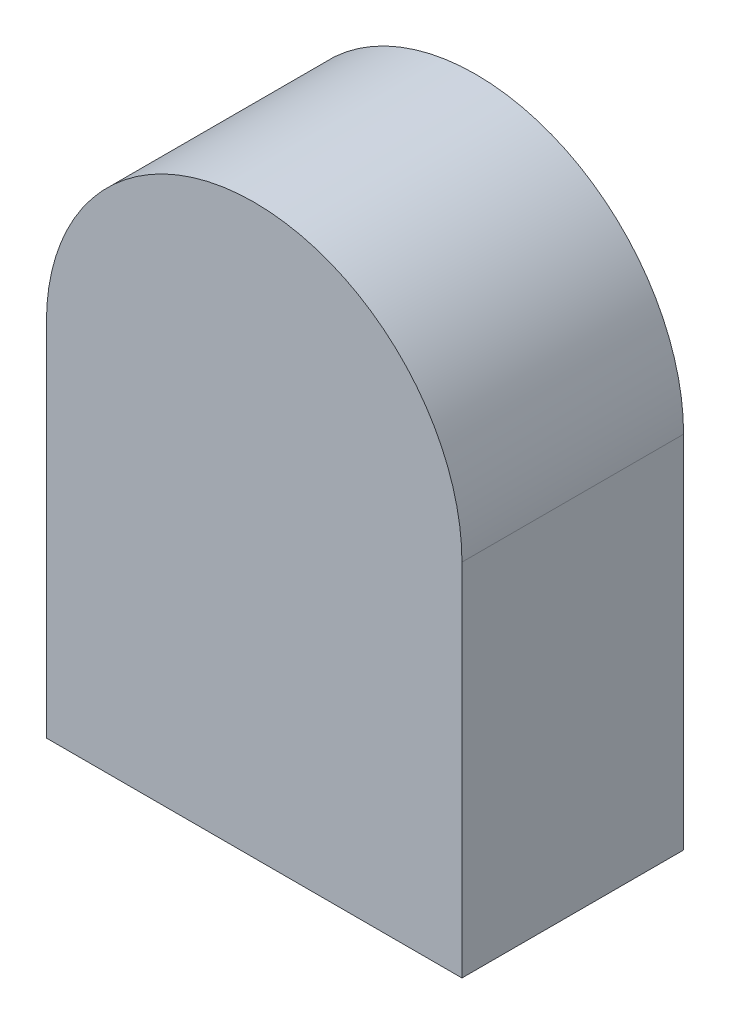
ISO-10303-21;
HEADER;
FILE_DESCRIPTION(('STEP AP214'),'2;1');
FILE_NAME('part.step','',(''),(''),'','','');
FILE_SCHEMA(('AUTOMOTIVE_DESIGN { 1 0 10303 214 1 1 1 1 }'));
ENDSEC;
DATA;
#1=APPLICATION_CONTEXT('core data for automotive mechanical design processes');
#2=APPLICATION_PROTOCOL_DEFINITION('international standard','automotive_design',2000,#1);
#3=PRODUCT_CONTEXT('',#1,'mechanical');
#4=PRODUCT('Part','Part','',(#3));
#5=PRODUCT_RELATED_PRODUCT_CATEGORY('part','',(#4));
#6=PRODUCT_DEFINITION_FORMATION('','',#4);
#7=PRODUCT_DEFINITION_CONTEXT('part definition',#1,'design');
#8=PRODUCT_DEFINITION('design','',#6,#7);
#9=PRODUCT_DEFINITION_SHAPE('','',#8);
#10=(LENGTH_UNIT() NAMED_UNIT(*) SI_UNIT(.MILLI.,.METRE.));
#11=(NAMED_UNIT(*) PLANE_ANGLE_UNIT() SI_UNIT($,.RADIAN.));
#12=(NAMED_UNIT(*) SI_UNIT($,.STERADIAN.) SOLID_ANGLE_UNIT());
#13=UNCERTAINTY_MEASURE_WITH_UNIT(LENGTH_MEASURE(1.E-05),#10,'distance_accuracy_value','');
#14=(GEOMETRIC_REPRESENTATION_CONTEXT(3) GLOBAL_UNCERTAINTY_ASSIGNED_CONTEXT((#13)) GLOBAL_UNIT_ASSIGNED_CONTEXT((#10,
#11,#12)) REPRESENTATION_CONTEXT('',''));
#15=CARTESIAN_POINT('',(0.,0.,0.));
#16=DIRECTION('',(0.,0.,1.));
#17=DIRECTION('',(1.,0.,0.));
#18=AXIS2_PLACEMENT_3D('',#15,#16,#17);
#19=CARTESIAN_POINT('',(-14.,0.,16.));
#20=DIRECTION('',(1.,0.,0.));
#21=DIRECTION('',(0.,0.,-1.));
#22=AXIS2_PLACEMENT_3D('',#19,#20,#21);
#23=PLANE('',#22);
#24=DIRECTION('',(0.,0.,-1.));
#25=VECTOR('',#24,1.);
#26=CARTESIAN_POINT('',(-14.,26.,16.));
#27=LINE('',#26,#25);
#28=CARTESIAN_POINT('',(-14.,26.,14.5));
#29=VERTEX_POINT('',#28);
#30=CARTESIAN_POINT('',(-14.,26.,0.));
#31=VERTEX_POINT('',#30);
#32=EDGE_CURVE('E166',#29,#31,#27,.T.);
#33=ORIENTED_EDGE('',*,*,#32,.F.);
#34=DIRECTION('',(0.,-1.,0.));
#35=VECTOR('',#34,1.);
#36=CARTESIAN_POINT('',(-14.,0.,14.5));
#37=LINE('',#36,#35);
#38=CARTESIAN_POINT('',(-14.,1.,14.5));
#39=VERTEX_POINT('',#38);
#40=EDGE_CURVE('E76',#29,#39,#37,.T.);
#41=ORIENTED_EDGE('',*,*,#40,.T.);
#42=DIRECTION('',(0.,0.,-1.));
#43=VECTOR('',#42,1.);
#44=CARTESIAN_POINT('',(-14.,1.,16.));
#45=LINE('',#44,#43);
#46=CARTESIAN_POINT('',(-14.,1.,0.));
#47=VERTEX_POINT('',#46);
#48=EDGE_CURVE('E168',#39,#47,#45,.T.);
#49=ORIENTED_EDGE('',*,*,#48,.T.);
#50=DIRECTION('',(0.,-1.,0.));
#51=VECTOR('',#50,1.);
#52=CARTESIAN_POINT('',(-14.,0.,0.));
#53=LINE('',#52,#51);
#54=EDGE_CURVE('E230',#31,#47,#53,.T.);
#55=ORIENTED_EDGE('',*,*,#54,.F.);
#56=EDGE_LOOP('',(#33,#41,#49,#55));
#57=FACE_BOUND('',#56,.T.);
#58=ADVANCED_FACE('F61',(#57),#23,.T.);
#59=CARTESIAN_POINT('',(-15.,1.,16.));
#60=DIRECTION('',(0.,1.,0.));
#61=DIRECTION('',(-1.,0.,0.));
#62=AXIS2_PLACEMENT_3D('',#59,#60,#61);
#63=PLANE('',#62);
#64=ORIENTED_EDGE('',*,*,#48,.F.);
#65=DIRECTION('',(1.,0.,0.));
#66=VECTOR('',#65,1.);
#67=CARTESIAN_POINT('',(-15.,1.,14.5));
#68=LINE('',#67,#66);
#69=CARTESIAN_POINT('',(14.,1.00000000000001,14.5));
#70=VERTEX_POINT('',#69);
#71=EDGE_CURVE('E160',#39,#70,#68,.T.);
#72=ORIENTED_EDGE('',*,*,#71,.T.);
#73=DIRECTION('',(0.,0.,-1.));
#74=VECTOR('',#73,1.);
#75=CARTESIAN_POINT('',(14.,1.00000000000001,16.));
#76=LINE('',#75,#74);
#77=CARTESIAN_POINT('',(14.,1.00000000000001,0.));
#78=VERTEX_POINT('',#77);
#79=EDGE_CURVE('E159',#70,#78,#76,.T.);
#80=ORIENTED_EDGE('',*,*,#79,.T.);
#81=DIRECTION('',(1.,0.,0.));
#82=VECTOR('',#81,1.);
#83=CARTESIAN_POINT('',(-15.,1.,0.));
#84=LINE('',#83,#82);
#85=CARTESIAN_POINT('',(3.,1.,0.));
#86=VERTEX_POINT('',#85);
#87=EDGE_CURVE('E223',#86,#78,#84,.T.);
#88=ORIENTED_EDGE('',*,*,#87,.F.);
#89=DIRECTION('',(0.,0.,-1.));
#90=VECTOR('',#89,1.);
#91=CARTESIAN_POINT('',(3.,1.,16.));
#92=LINE('',#91,#90);
#93=CARTESIAN_POINT('',(3.,1.,7.));
#94=VERTEX_POINT('',#93);
#95=EDGE_CURVE('E69',#94,#86,#92,.T.);
#96=ORIENTED_EDGE('',*,*,#95,.F.);
#97=CARTESIAN_POINT('',(0.,1.,7.));
#98=DIRECTION('',(0.,1.,0.));
#99=DIRECTION('',(-1.,0.,0.));
#100=AXIS2_PLACEMENT_3D('',#97,#98,#99);
#101=CIRCLE('',#100,3.);
#102=CARTESIAN_POINT('',(-3.,1.,7.));
#103=VERTEX_POINT('',#102);
#104=EDGE_CURVE('E206',#103,#94,#101,.T.);
#105=ORIENTED_EDGE('',*,*,#104,.F.);
#106=DIRECTION('',(0.,0.,1.));
#107=VECTOR('',#106,1.);
#108=CARTESIAN_POINT('',(-3.,1.,16.));
#109=LINE('',#108,#107);
#110=CARTESIAN_POINT('',(-3.,1.,0.));
#111=VERTEX_POINT('',#110);
#112=EDGE_CURVE('E204',#111,#103,#109,.T.);
#113=ORIENTED_EDGE('',*,*,#112,.F.);
#114=EDGE_CURVE('E229',#47,#111,#84,.T.);
#115=ORIENTED_EDGE('',*,*,#114,.F.);
#116=EDGE_LOOP('',(#64,#72,#80,#88,#96,#105,#113,#115));
#117=FACE_BOUND('',#116,.T.);
#118=ADVANCED_FACE('F228',(#117),#63,.T.);
#119=CARTESIAN_POINT('',(14.,26.,16.));
#120=DIRECTION('',(-1.,0.,0.));
#121=DIRECTION('',(0.,-1.,0.));
#122=AXIS2_PLACEMENT_3D('',#119,#120,#121);
#123=PLANE('',#122);
#124=ORIENTED_EDGE('',*,*,#79,.F.);
#125=DIRECTION('',(0.,1.,0.));
#126=VECTOR('',#125,1.);
#127=CARTESIAN_POINT('',(14.,26.,14.5));
#128=LINE('',#127,#126);
#129=CARTESIAN_POINT('',(14.,26.,14.5));
#130=VERTEX_POINT('',#129);
#131=EDGE_CURVE('E148',#70,#130,#128,.T.);
#132=ORIENTED_EDGE('',*,*,#131,.T.);
#133=DIRECTION('',(0.,0.,-1.));
#134=VECTOR('',#133,1.);
#135=CARTESIAN_POINT('',(14.,26.,16.));
#136=LINE('',#135,#134);
#137=CARTESIAN_POINT('',(14.,26.,0.));
#138=VERTEX_POINT('',#137);
#139=EDGE_CURVE('E157',#130,#138,#136,.T.);
#140=ORIENTED_EDGE('',*,*,#139,.T.);
#141=DIRECTION('',(0.,1.,0.));
#142=VECTOR('',#141,1.);
#143=CARTESIAN_POINT('',(14.,26.,0.));
#144=LINE('',#143,#142);
#145=EDGE_CURVE('E233',#78,#138,#144,.T.);
#146=ORIENTED_EDGE('',*,*,#145,.F.);
#147=EDGE_LOOP('',(#124,#132,#140,#146));
#148=FACE_BOUND('',#147,.T.);
#149=ADVANCED_FACE('F155',(#148),#123,.T.);
#150=CARTESIAN_POINT('',(0.,26.,16.));
#151=DIRECTION('',(0.,0.,-1.));
#152=DIRECTION('',(-1.,0.,0.));
#153=AXIS2_PLACEMENT_3D('',#150,#151,#152);
#154=CYLINDRICAL_SURFACE('',#153,14.);
#155=ORIENTED_EDGE('',*,*,#139,.F.);
#156=CARTESIAN_POINT('',(0.,26.,14.5));
#157=DIRECTION('',(0.,0.,1.));
#158=DIRECTION('',(1.,0.,0.));
#159=AXIS2_PLACEMENT_3D('',#156,#157,#158);
#160=CIRCLE('',#159,14.);
#161=EDGE_CURVE('E12',#130,#29,#160,.T.);
#162=ORIENTED_EDGE('',*,*,#161,.T.);
#163=ORIENTED_EDGE('',*,*,#32,.T.);
#164=CARTESIAN_POINT('',(0.,26.,0.));
#165=DIRECTION('',(0.,0.,1.));
#166=DIRECTION('',(1.,0.,0.));
#167=AXIS2_PLACEMENT_3D('',#164,#165,#166);
#168=CIRCLE('',#167,14.);
#169=EDGE_CURVE('E164',#138,#31,#168,.T.);
#170=ORIENTED_EDGE('',*,*,#169,.F.);
#171=EDGE_LOOP('',(#155,#162,#163,#170));
#172=FACE_BOUND('',#171,.T.);
#173=ADVANCED_FACE('F162',(#172),#154,.F.);
#174=CARTESIAN_POINT('',(0.,26.,16.));
#175=DIRECTION('',(0.,0.,1.));
#176=DIRECTION('',(1.,0.,0.));
#177=AXIS2_PLACEMENT_3D('',#174,#175,#176);
#178=PLANE('',#177);
#179=DIRECTION('',(0.,-1.,0.));
#180=VECTOR('',#179,1.);
#181=CARTESIAN_POINT('',(-15.,0.,16.));
#182=LINE('',#181,#180);
#183=CARTESIAN_POINT('',(-15.,26.,16.));
#184=VERTEX_POINT('',#183);
#185=CARTESIAN_POINT('',(-15.,0.,16.));
#186=VERTEX_POINT('',#185);
#187=EDGE_CURVE('E175',#184,#186,#182,.T.);
#188=ORIENTED_EDGE('',*,*,#187,.T.);
#189=DIRECTION('',(1.,0.,0.));
#190=VECTOR('',#189,1.);
#191=CARTESIAN_POINT('',(-15.,0.,16.));
#192=LINE('',#191,#190);
#193=CARTESIAN_POINT('',(15.,0.,16.));
#194=VERTEX_POINT('',#193);
#195=EDGE_CURVE('E178',#186,#194,#192,.T.);
#196=ORIENTED_EDGE('',*,*,#195,.T.);
#197=DIRECTION('',(0.,1.,0.));
#198=VECTOR('',#197,1.);
#199=CARTESIAN_POINT('',(15.,26.,16.));
#200=LINE('',#199,#198);
#201=CARTESIAN_POINT('',(15.,26.,16.));
#202=VERTEX_POINT('',#201);
#203=EDGE_CURVE('E181',#194,#202,#200,.T.);
#204=ORIENTED_EDGE('',*,*,#203,.T.);
#205=CARTESIAN_POINT('',(0.,26.,16.));
#206=DIRECTION('',(0.,0.,1.));
#207=DIRECTION('',(1.,0.,0.));
#208=AXIS2_PLACEMENT_3D('',#205,#206,#207);
#209=CIRCLE('',#208,15.);
#210=EDGE_CURVE('E183',#202,#184,#209,.T.);
#211=ORIENTED_EDGE('',*,*,#210,.T.);
#212=EDGE_LOOP('',(#188,#196,#204,#211));
#213=FACE_BOUND('',#212,.T.);
#214=ADVANCED_FACE('F277',(#213),#178,.T.);
#215=CARTESIAN_POINT('',(0.,26.,0.));
#216=DIRECTION('',(0.,0.,1.));
#217=DIRECTION('',(1.,0.,0.));
#218=AXIS2_PLACEMENT_3D('',#215,#216,#217);
#219=PLANE('',#218);
#220=DIRECTION('',(1.,0.,0.));
#221=VECTOR('',#220,1.);
#222=CARTESIAN_POINT('',(-15.,0.,0.));
#223=LINE('',#222,#221);
#224=CARTESIAN_POINT('',(3.,0.,0.));
#225=VERTEX_POINT('',#224);
#226=CARTESIAN_POINT('',(15.,0.,0.));
#227=VERTEX_POINT('',#226);
#228=EDGE_CURVE('E188',#225,#227,#223,.T.);
#229=ORIENTED_EDGE('',*,*,#228,.F.);
#230=DIRECTION('',(0.,-1.,0.));
#231=VECTOR('',#230,1.);
#232=CARTESIAN_POINT('',(3.,10.,0.));
#233=LINE('',#232,#231);
#234=EDGE_CURVE('E213',#86,#225,#233,.T.);
#235=ORIENTED_EDGE('',*,*,#234,.F.);
#236=ORIENTED_EDGE('',*,*,#87,.T.);
#237=ORIENTED_EDGE('',*,*,#145,.T.);
#238=ORIENTED_EDGE('',*,*,#169,.T.);
#239=ORIENTED_EDGE('',*,*,#54,.T.);
#240=ORIENTED_EDGE('',*,*,#114,.T.);
#241=DIRECTION('',(0.,-1.,0.));
#242=VECTOR('',#241,1.);
#243=CARTESIAN_POINT('',(-3.,10.,0.));
#244=LINE('',#243,#242);
#245=CARTESIAN_POINT('',(-3.,0.,0.));
#246=VERTEX_POINT('',#245);
#247=EDGE_CURVE('E83',#111,#246,#244,.T.);
#248=ORIENTED_EDGE('',*,*,#247,.T.);
#249=CARTESIAN_POINT('',(-15.,0.,0.));
#250=VERTEX_POINT('',#249);
#251=EDGE_CURVE('E189',#250,#246,#223,.T.);
#252=ORIENTED_EDGE('',*,*,#251,.F.);
#253=DIRECTION('',(0.,-1.,0.));
#254=VECTOR('',#253,1.);
#255=CARTESIAN_POINT('',(-15.,0.,0.));
#256=LINE('',#255,#254);
#257=CARTESIAN_POINT('',(-15.,26.,0.));
#258=VERTEX_POINT('',#257);
#259=EDGE_CURVE('E174',#258,#250,#256,.T.);
#260=ORIENTED_EDGE('',*,*,#259,.F.);
#261=CARTESIAN_POINT('',(0.,26.,0.));
#262=DIRECTION('',(0.,0.,1.));
#263=DIRECTION('',(1.,0.,0.));
#264=AXIS2_PLACEMENT_3D('',#261,#262,#263);
#265=CIRCLE('',#264,15.);
#266=CARTESIAN_POINT('',(15.,26.,0.));
#267=VERTEX_POINT('',#266);
#268=EDGE_CURVE('E179',#267,#258,#265,.T.);
#269=ORIENTED_EDGE('',*,*,#268,.F.);
#270=DIRECTION('',(0.,1.,0.));
#271=VECTOR('',#270,1.);
#272=CARTESIAN_POINT('',(15.,26.,0.));
#273=LINE('',#272,#271);
#274=EDGE_CURVE('E192',#227,#267,#273,.T.);
#275=ORIENTED_EDGE('',*,*,#274,.F.);
#276=EDGE_LOOP('',(#229,#235,#236,#237,#238,#239,#240,#248,#252,#260,#269,#275));
#277=FACE_BOUND('',#276,.T.);
#278=ADVANCED_FACE('F222',(#277),#219,.F.);
#279=CARTESIAN_POINT('',(-15.,0.,16.));
#280=DIRECTION('',(1.,0.,0.));
#281=DIRECTION('',(0.,0.,-1.));
#282=AXIS2_PLACEMENT_3D('',#279,#280,#281);
#283=PLANE('',#282);
#284=DIRECTION('',(0.,0.,-1.));
#285=VECTOR('',#284,1.);
#286=CARTESIAN_POINT('',(-15.,26.,16.));
#287=LINE('',#286,#285);
#288=EDGE_CURVE('E185',#184,#258,#287,.T.);
#289=ORIENTED_EDGE('',*,*,#288,.T.);
#290=ORIENTED_EDGE('',*,*,#259,.T.);
#291=DIRECTION('',(0.,0.,-1.));
#292=VECTOR('',#291,1.);
#293=CARTESIAN_POINT('',(-15.,0.,16.));
#294=LINE('',#293,#292);
#295=EDGE_CURVE('E202',#186,#250,#294,.T.);
#296=ORIENTED_EDGE('',*,*,#295,.F.);
#297=ORIENTED_EDGE('',*,*,#187,.F.);
#298=EDGE_LOOP('',(#289,#290,#296,#297));
#299=FACE_BOUND('',#298,.T.);
#300=ADVANCED_FACE('F63',(#299),#283,.F.);
#301=CARTESIAN_POINT('',(-15.,0.,16.));
#302=DIRECTION('',(0.,1.,0.));
#303=DIRECTION('',(-1.,0.,0.));
#304=AXIS2_PLACEMENT_3D('',#301,#302,#303);
#305=PLANE('',#304);
#306=ORIENTED_EDGE('',*,*,#295,.T.);
#307=ORIENTED_EDGE('',*,*,#251,.T.);
#308=DIRECTION('',(0.,0.,-1.));
#309=VECTOR('',#308,1.);
#310=CARTESIAN_POINT('',(-3.,0.,7.));
#311=LINE('',#310,#309);
#312=CARTESIAN_POINT('',(-3.,0.,7.));
#313=VERTEX_POINT('',#312);
#314=EDGE_CURVE('E252',#313,#246,#311,.T.);
#315=ORIENTED_EDGE('',*,*,#314,.F.);
#316=CARTESIAN_POINT('',(0.,0.,7.));
#317=DIRECTION('',(0.,-1.,0.));
#318=DIRECTION('',(1.,0.,0.));
#319=AXIS2_PLACEMENT_3D('',#316,#317,#318);
#320=CIRCLE('',#319,3.);
#321=CARTESIAN_POINT('',(3.,0.,7.));
#322=VERTEX_POINT('',#321);
#323=EDGE_CURVE('E248',#322,#313,#320,.T.);
#324=ORIENTED_EDGE('',*,*,#323,.F.);
#325=DIRECTION('',(0.,0.,1.));
#326=VECTOR('',#325,1.);
#327=CARTESIAN_POINT('',(3.,0.,7.));
#328=LINE('',#327,#326);
#329=EDGE_CURVE('E250',#225,#322,#328,.T.);
#330=ORIENTED_EDGE('',*,*,#329,.F.);
#331=ORIENTED_EDGE('',*,*,#228,.T.);
#332=DIRECTION('',(0.,0.,-1.));
#333=VECTOR('',#332,1.);
#334=CARTESIAN_POINT('',(15.,0.,16.));
#335=LINE('',#334,#333);
#336=EDGE_CURVE('E200',#194,#227,#335,.T.);
#337=ORIENTED_EDGE('',*,*,#336,.F.);
#338=ORIENTED_EDGE('',*,*,#195,.F.);
#339=EDGE_LOOP('',(#306,#307,#315,#324,#330,#331,#337,#338));
#340=FACE_BOUND('',#339,.T.);
#341=ADVANCED_FACE('F262',(#340),#305,.F.);
#342=CARTESIAN_POINT('',(15.,26.,16.));
#343=DIRECTION('',(-1.,0.,0.));
#344=DIRECTION('',(0.,-1.,0.));
#345=AXIS2_PLACEMENT_3D('',#342,#343,#344);
#346=PLANE('',#345);
#347=ORIENTED_EDGE('',*,*,#336,.T.);
#348=ORIENTED_EDGE('',*,*,#274,.T.);
#349=DIRECTION('',(0.,0.,-1.));
#350=VECTOR('',#349,1.);
#351=CARTESIAN_POINT('',(15.,26.,16.));
#352=LINE('',#351,#350);
#353=EDGE_CURVE('E198',#202,#267,#352,.T.);
#354=ORIENTED_EDGE('',*,*,#353,.F.);
#355=ORIENTED_EDGE('',*,*,#203,.F.);
#356=EDGE_LOOP('',(#347,#348,#354,#355));
#357=FACE_BOUND('',#356,.T.);
#358=ADVANCED_FACE('F275',(#357),#346,.F.);
#359=CARTESIAN_POINT('',(0.,26.,16.));
#360=DIRECTION('',(0.,0.,-1.));
#361=DIRECTION('',(-1.,0.,0.));
#362=AXIS2_PLACEMENT_3D('',#359,#360,#361);
#363=CYLINDRICAL_SURFACE('',#362,15.);
#364=ORIENTED_EDGE('',*,*,#353,.T.);
#365=ORIENTED_EDGE('',*,*,#268,.T.);
#366=ORIENTED_EDGE('',*,*,#288,.F.);
#367=ORIENTED_EDGE('',*,*,#210,.F.);
#368=EDGE_LOOP('',(#364,#365,#366,#367));
#369=FACE_BOUND('',#368,.T.);
#370=ADVANCED_FACE('F270',(#369),#363,.T.);
#371=CARTESIAN_POINT('',(0.,10.,7.));
#372=DIRECTION('',(0.,-1.,0.));
#373=DIRECTION('',(1.,0.,0.));
#374=AXIS2_PLACEMENT_3D('',#371,#372,#373);
#375=CYLINDRICAL_SURFACE('',#374,3.);
#376=ORIENTED_EDGE('',*,*,#104,.T.);
#377=DIRECTION('',(0.,-1.,0.));
#378=VECTOR('',#377,1.);
#379=CARTESIAN_POINT('',(3.,10.,7.));
#380=LINE('',#379,#378);
#381=EDGE_CURVE('E215',#94,#322,#380,.T.);
#382=ORIENTED_EDGE('',*,*,#381,.T.);
#383=ORIENTED_EDGE('',*,*,#323,.T.);
#384=DIRECTION('',(0.,-1.,0.));
#385=VECTOR('',#384,1.);
#386=CARTESIAN_POINT('',(-3.,10.,7.));
#387=LINE('',#386,#385);
#388=EDGE_CURVE('E243',#103,#313,#387,.T.);
#389=ORIENTED_EDGE('',*,*,#388,.F.);
#390=EDGE_LOOP('',(#376,#382,#383,#389));
#391=FACE_BOUND('',#390,.T.);
#392=ADVANCED_FACE('F246',(#391),#375,.F.);
#393=CARTESIAN_POINT('',(3.,10.,7.));
#394=DIRECTION('',(1.,0.,0.));
#395=DIRECTION('',(0.,0.,-1.));
#396=AXIS2_PLACEMENT_3D('',#393,#394,#395);
#397=PLANE('',#396);
#398=ORIENTED_EDGE('',*,*,#95,.T.);
#399=ORIENTED_EDGE('',*,*,#234,.T.);
#400=ORIENTED_EDGE('',*,*,#329,.T.);
#401=ORIENTED_EDGE('',*,*,#381,.F.);
#402=EDGE_LOOP('',(#398,#399,#400,#401));
#403=FACE_BOUND('',#402,.T.);
#404=ADVANCED_FACE('F211',(#403),#397,.F.);
#405=CARTESIAN_POINT('',(-3.,10.,7.));
#406=DIRECTION('',(-1.,0.,0.));
#407=DIRECTION('',(0.,0.,1.));
#408=AXIS2_PLACEMENT_3D('',#405,#406,#407);
#409=PLANE('',#408);
#410=ORIENTED_EDGE('',*,*,#112,.T.);
#411=ORIENTED_EDGE('',*,*,#388,.T.);
#412=ORIENTED_EDGE('',*,*,#314,.T.);
#413=ORIENTED_EDGE('',*,*,#247,.F.);
#414=EDGE_LOOP('',(#410,#411,#412,#413));
#415=FACE_BOUND('',#414,.T.);
#416=ADVANCED_FACE('F242',(#415),#409,.F.);
#417=CARTESIAN_POINT('',(0.,26.,14.5));
#418=DIRECTION('',(0.,0.,1.));
#419=DIRECTION('',(1.,0.,0.));
#420=AXIS2_PLACEMENT_3D('',#417,#418,#419);
#421=PLANE('',#420);
#422=ORIENTED_EDGE('',*,*,#40,.F.);
#423=ORIENTED_EDGE('',*,*,#161,.F.);
#424=ORIENTED_EDGE('',*,*,#131,.F.);
#425=ORIENTED_EDGE('',*,*,#71,.F.);
#426=EDGE_LOOP('',(#422,#423,#424,#425));
#427=FACE_BOUND('',#426,.T.);
#428=ADVANCED_FACE('F147',(#427),#421,.F.);
#429=CLOSED_SHELL('',(#58,#118,#149,#173,#214,#278,#300,#341,#358,#370,#392,#404,#416,#428));
#430=MANIFOLD_SOLID_BREP('B2',#429);
#431=ADVANCED_BREP_SHAPE_REPRESENTATION('',(#18,#430),#14);
#432=SHAPE_DEFINITION_REPRESENTATION(#9,#431);
ENDSEC;
END-ISO-10303-21;
